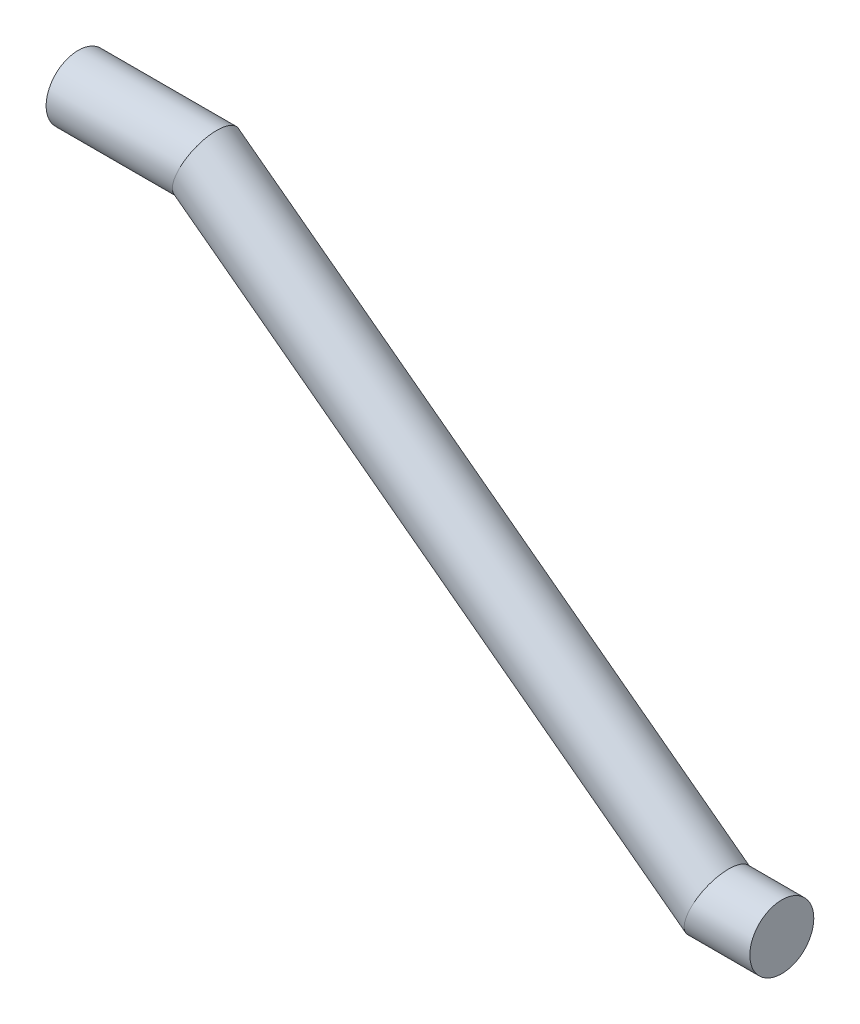
ISO-10303-21;
HEADER;
FILE_DESCRIPTION(('STEP AP214'),'2;1');
FILE_NAME('part.step','',(''),(''),'','','');
FILE_SCHEMA(('AUTOMOTIVE_DESIGN { 1 0 10303 214 1 1 1 1 }'));
ENDSEC;
DATA;
#1=APPLICATION_CONTEXT('core data for automotive mechanical design processes');
#2=APPLICATION_PROTOCOL_DEFINITION('international standard','automotive_design',2000,#1);
#3=PRODUCT_CONTEXT('',#1,'mechanical');
#4=PRODUCT('Part','Part','',(#3));
#5=PRODUCT_RELATED_PRODUCT_CATEGORY('part','',(#4));
#6=PRODUCT_DEFINITION_FORMATION('','',#4);
#7=PRODUCT_DEFINITION_CONTEXT('part definition',#1,'design');
#8=PRODUCT_DEFINITION('design','',#6,#7);
#9=PRODUCT_DEFINITION_SHAPE('','',#8);
#10=(LENGTH_UNIT() NAMED_UNIT(*) SI_UNIT(.MILLI.,.METRE.));
#11=(NAMED_UNIT(*) PLANE_ANGLE_UNIT() SI_UNIT($,.RADIAN.));
#12=(NAMED_UNIT(*) SI_UNIT($,.STERADIAN.) SOLID_ANGLE_UNIT());
#13=UNCERTAINTY_MEASURE_WITH_UNIT(LENGTH_MEASURE(1.E-05),#10,'distance_accuracy_value','');
#14=(GEOMETRIC_REPRESENTATION_CONTEXT(3) GLOBAL_UNCERTAINTY_ASSIGNED_CONTEXT((#13)) GLOBAL_UNIT_ASSIGNED_CONTEXT((#10,
#11,#12)) REPRESENTATION_CONTEXT('',''));
#15=CARTESIAN_POINT('',(0.,0.,0.));
#16=DIRECTION('',(0.,0.,1.));
#17=DIRECTION('',(1.,0.,0.));
#18=AXIS2_PLACEMENT_3D('',#15,#16,#17);
#19=CARTESIAN_POINT('',(550.,-300.,0.));
#20=DIRECTION('',(1.,0.,0.));
#21=DIRECTION('',(0.,0.,-1.));
#22=AXIS2_PLACEMENT_3D('',#19,#20,#21);
#23=PLANE('',#22);
#24=CARTESIAN_POINT('',(550.,-300.,0.));
#25=DIRECTION('',(1.,0.,0.));
#26=DIRECTION('',(0.,0.,-1.));
#27=AXIS2_PLACEMENT_3D('',#24,#25,#26);
#28=CIRCLE('',#27,25.);
#29=CARTESIAN_POINT('',(550.,-300.,-25.));
#30=VERTEX_POINT('',#29);
#31=EDGE_CURVE('E44',#30,#30,#28,.T.);
#32=ORIENTED_EDGE('',*,*,#31,.T.);
#33=EDGE_LOOP('',(#32));
#34=FACE_BOUND('',#33,.T.);
#35=ADVANCED_FACE('F41',(#34),#23,.T.);
#36=CARTESIAN_POINT('',(0.,0.,0.));
#37=DIRECTION('',(1.,0.,0.));
#38=DIRECTION('',(0.,0.,-1.));
#39=AXIS2_PLACEMENT_3D('',#36,#37,#38);
#40=PLANE('',#39);
#41=CARTESIAN_POINT('',(0.,0.,0.));
#42=DIRECTION('',(1.,0.,0.));
#43=DIRECTION('',(0.,0.,-1.));
#44=AXIS2_PLACEMENT_3D('',#41,#42,#43);
#45=CIRCLE('',#44,25.);
#46=CARTESIAN_POINT('',(0.,0.,-25.));
#47=VERTEX_POINT('',#46);
#48=EDGE_CURVE('E48',#47,#47,#45,.T.);
#49=ORIENTED_EDGE('',*,*,#48,.F.);
#50=EDGE_LOOP('',(#49));
#51=FACE_BOUND('',#50,.T.);
#52=ADVANCED_FACE('F65',(#51),#40,.F.);
#53=CARTESIAN_POINT('',(481.566666666667,-300.,0.));
#54=DIRECTION('',(1.,0.,0.));
#55=DIRECTION('',(0.,0.,-1.));
#56=AXIS2_PLACEMENT_3D('',#53,#54,#55);
#57=CYLINDRICAL_SURFACE('',#56,25.);
#58=CARTESIAN_POINT('',(500.,-300.,0.));
#59=DIRECTION('',(0.948683298050514,-0.316227766016838,0.));
#60=DIRECTION('',(-0.316227766016838,-0.948683298050514,0.));
#61=AXIS2_PLACEMENT_3D('',#58,#59,#60);
#62=ELLIPSE('',#61,26.3523138347365,25.);
#63=CARTESIAN_POINT('',(491.666666666667,-325.,0.));
#64=VERTEX_POINT('',#63);
#65=EDGE_CURVE('E53',#64,#64,#62,.F.);
#66=ORIENTED_EDGE('',*,*,#65,.F.);
#67=EDGE_LOOP('',(#66));
#68=FACE_BOUND('',#67,.T.);
#69=ORIENTED_EDGE('',*,*,#31,.F.);
#70=EDGE_LOOP('',(#69));
#71=FACE_BOUND('',#70,.T.);
#72=ADVANCED_FACE('F62',(#68,#71),#57,.T.);
#73=CARTESIAN_POINT('',(85.2533333333333,11.06,0.));
#74=DIRECTION('',(0.8,-0.6,0.));
#75=DIRECTION('',(0.6,0.8,0.));
#76=AXIS2_PLACEMENT_3D('',#73,#74,#75);
#77=CYLINDRICAL_SURFACE('',#76,25.);
#78=CARTESIAN_POINT('',(100.,0.,0.));
#79=DIRECTION('',(0.948683298050514,-0.316227766016838,0.));
#80=DIRECTION('',(0.316227766016838,0.948683298050514,0.));
#81=AXIS2_PLACEMENT_3D('',#78,#79,#80);
#82=ELLIPSE('',#81,26.3523138347365,25.);
#83=CARTESIAN_POINT('',(108.333333333333,25.,0.));
#84=VERTEX_POINT('',#83);
#85=EDGE_CURVE('E12',#84,#84,#82,.F.);
#86=ORIENTED_EDGE('',*,*,#85,.F.);
#87=EDGE_LOOP('',(#86));
#88=FACE_BOUND('',#87,.T.);
#89=ORIENTED_EDGE('',*,*,#65,.T.);
#90=EDGE_LOOP('',(#89));
#91=FACE_BOUND('',#90,.T.);
#92=ADVANCED_FACE('F64',(#88,#91),#77,.T.);
#93=CARTESIAN_POINT('',(0.,0.,0.));
#94=DIRECTION('',(1.,0.,0.));
#95=DIRECTION('',(0.,0.,-1.));
#96=AXIS2_PLACEMENT_3D('',#93,#94,#95);
#97=CYLINDRICAL_SURFACE('',#96,25.);
#98=ORIENTED_EDGE('',*,*,#48,.T.);
#99=EDGE_LOOP('',(#98));
#100=FACE_BOUND('',#99,.T.);
#101=ORIENTED_EDGE('',*,*,#85,.T.);
#102=EDGE_LOOP('',(#101));
#103=FACE_BOUND('',#102,.T.);
#104=ADVANCED_FACE('F72',(#100,#103),#97,.T.);
#105=CLOSED_SHELL('',(#35,#52,#72,#92,#104));
#106=MANIFOLD_SOLID_BREP('B2',#105);
#107=ADVANCED_BREP_SHAPE_REPRESENTATION('',(#18,#106),#14);
#108=SHAPE_DEFINITION_REPRESENTATION(#9,#107);
ENDSEC;
END-ISO-10303-21;
